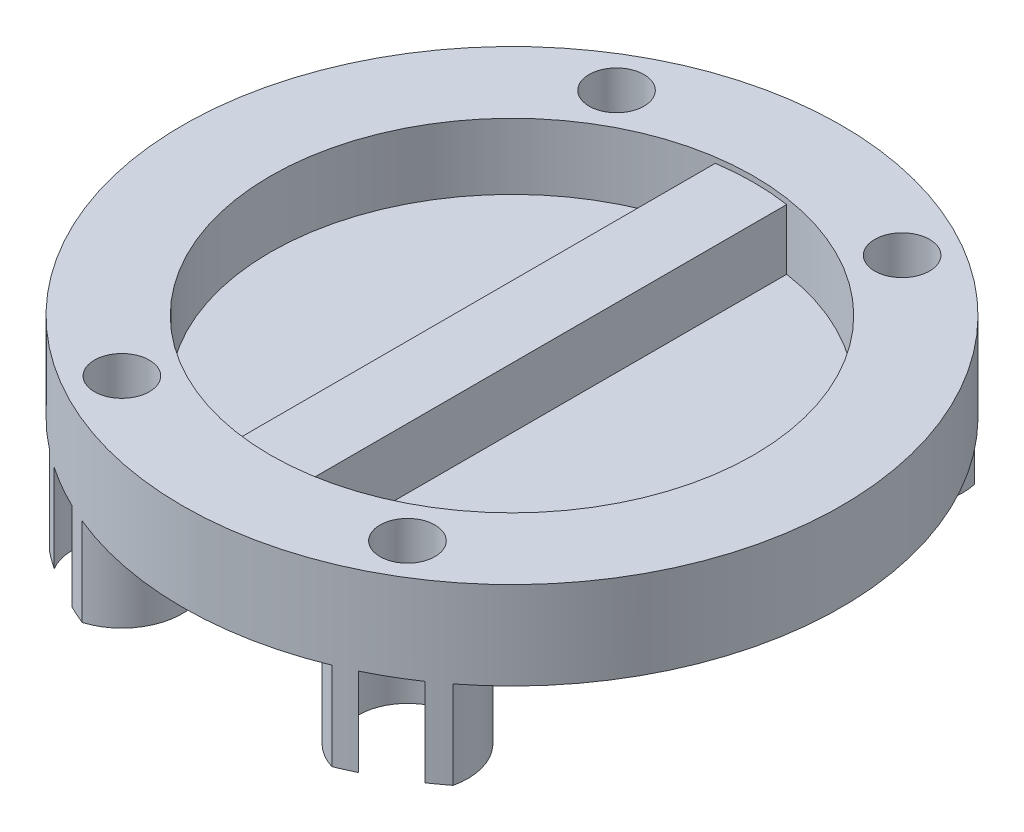
ISO-10303-21;
HEADER;
FILE_DESCRIPTION(('STEP AP214'),'2;1');
FILE_NAME('part.step','',(''),(''),'','','');
FILE_SCHEMA(('AUTOMOTIVE_DESIGN { 1 0 10303 214 1 1 1 1 }'));
ENDSEC;
DATA;
#1=APPLICATION_CONTEXT('core data for automotive mechanical design processes');
#2=APPLICATION_PROTOCOL_DEFINITION('international standard','automotive_design',2000,#1);
#3=PRODUCT_CONTEXT('',#1,'mechanical');
#4=PRODUCT('Part','Part','',(#3));
#5=PRODUCT_RELATED_PRODUCT_CATEGORY('part','',(#4));
#6=PRODUCT_DEFINITION_FORMATION('','',#4);
#7=PRODUCT_DEFINITION_CONTEXT('part definition',#1,'design');
#8=PRODUCT_DEFINITION('design','',#6,#7);
#9=PRODUCT_DEFINITION_SHAPE('','',#8);
#10=(LENGTH_UNIT() NAMED_UNIT(*) SI_UNIT(.MILLI.,.METRE.));
#11=(NAMED_UNIT(*) PLANE_ANGLE_UNIT() SI_UNIT($,.RADIAN.));
#12=(NAMED_UNIT(*) SI_UNIT($,.STERADIAN.) SOLID_ANGLE_UNIT());
#13=UNCERTAINTY_MEASURE_WITH_UNIT(LENGTH_MEASURE(1.E-05),#10,'distance_accuracy_value','');
#14=(GEOMETRIC_REPRESENTATION_CONTEXT(3) GLOBAL_UNCERTAINTY_ASSIGNED_CONTEXT((#13)) GLOBAL_UNIT_ASSIGNED_CONTEXT((#10,
#11,#12)) REPRESENTATION_CONTEXT('',''));
#15=CARTESIAN_POINT('',(0.,0.,0.));
#16=DIRECTION('',(0.,0.,1.));
#17=DIRECTION('',(1.,0.,0.));
#18=AXIS2_PLACEMENT_3D('',#15,#16,#17);
#19=CARTESIAN_POINT('',(0.,0.,0.));
#20=DIRECTION('',(0.,1.,0.));
#21=DIRECTION('',(0.,0.,1.));
#22=AXIS2_PLACEMENT_3D('',#19,#20,#21);
#23=PLANE('',#22);
#24=CARTESIAN_POINT('',(0.,0.,0.));
#25=DIRECTION('',(0.,1.,0.));
#26=DIRECTION('',(0.,0.,1.));
#27=AXIS2_PLACEMENT_3D('',#24,#25,#26);
#28=CIRCLE('',#27,24.);
#29=CARTESIAN_POINT('',(-14.6932868781607,0.,-18.9764938994555));
#30=VERTEX_POINT('',#29);
#31=CARTESIAN_POINT('',(-14.6932868781607,0.,18.9764938994555));
#32=VERTEX_POINT('',#31);
#33=EDGE_CURVE('E403',#30,#32,#28,.T.);
#34=ORIENTED_EDGE('',*,*,#33,.F.);
#35=CARTESIAN_POINT('',(-10.4000000000001,0.,-18.0133283987163));
#36=DIRECTION('',(0.,1.,0.));
#37=DIRECTION('',(0.,0.,1.));
#38=AXIS2_PLACEMENT_3D('',#35,#36,#37);
#39=CIRCLE('',#38,4.39999999999999);
#40=CARTESIAN_POINT('',(-9.08748235260878,0.,-22.2130066513073));
#41=VERTEX_POINT('',#40);
#42=EDGE_CURVE('E111',#30,#41,#39,.T.);
#43=ORIENTED_EDGE('',*,*,#42,.T.);
#44=CARTESIAN_POINT('',(9.08748235260879,0.,-22.2130066513073));
#45=VERTEX_POINT('',#44);
#46=EDGE_CURVE('E496',#45,#41,#28,.T.);
#47=ORIENTED_EDGE('',*,*,#46,.F.);
#48=CARTESIAN_POINT('',(10.4000000000001,0.,-18.0133283987163));
#49=DIRECTION('',(0.,1.,0.));
#50=DIRECTION('',(0.,0.,1.));
#51=AXIS2_PLACEMENT_3D('',#48,#49,#50);
#52=CIRCLE('',#51,4.4);
#53=CARTESIAN_POINT('',(14.6932868781607,0.,-18.9764938994555));
#54=VERTEX_POINT('',#53);
#55=EDGE_CURVE('E304',#54,#45,#52,.F.);
#56=ORIENTED_EDGE('',*,*,#55,.F.);
#57=CARTESIAN_POINT('',(14.6932868781605,0.,18.9764938994556));
#58=VERTEX_POINT('',#57);
#59=EDGE_CURVE('E490',#58,#54,#28,.T.);
#60=ORIENTED_EDGE('',*,*,#59,.F.);
#61=CARTESIAN_POINT('',(10.4000000000001,0.,18.0133283987163));
#62=DIRECTION('',(0.,1.,0.));
#63=DIRECTION('',(0.,0.,1.));
#64=AXIS2_PLACEMENT_3D('',#61,#62,#63);
#65=CIRCLE('',#64,4.4);
#66=CARTESIAN_POINT('',(9.08748235260868,0.,22.2130066513074));
#67=VERTEX_POINT('',#66);
#68=EDGE_CURVE('E328',#58,#67,#65,.T.);
#69=ORIENTED_EDGE('',*,*,#68,.T.);
#70=CARTESIAN_POINT('',(-9.08748235260879,0.,22.2130066513073));
#71=VERTEX_POINT('',#70);
#72=EDGE_CURVE('E409',#71,#67,#28,.T.);
#73=ORIENTED_EDGE('',*,*,#72,.F.);
#74=CARTESIAN_POINT('',(-10.4000000000001,0.,18.0133283987163));
#75=DIRECTION('',(0.,1.,0.));
#76=DIRECTION('',(0.,0.,1.));
#77=AXIS2_PLACEMENT_3D('',#74,#75,#76);
#78=CIRCLE('',#77,4.39999999999999);
#79=EDGE_CURVE('E344',#32,#71,#78,.F.);
#80=ORIENTED_EDGE('',*,*,#79,.F.);
#81=EDGE_LOOP('',(#34,#43,#47,#56,#60,#69,#73,#80));
#82=FACE_BOUND('',#81,.T.);
#83=DIRECTION('',(0.,0.,1.));
#84=VECTOR('',#83,1.);
#85=CARTESIAN_POINT('',(-1.,0.,-19.6));
#86=LINE('',#85,#84);
#87=CARTESIAN_POINT('',(-1.,0.,-19.6));
#88=VERTEX_POINT('',#87);
#89=CARTESIAN_POINT('',(-0.999999999999999,0.,19.6));
#90=VERTEX_POINT('',#89);
#91=EDGE_CURVE('E103',#88,#90,#86,.T.);
#92=ORIENTED_EDGE('',*,*,#91,.T.);
#93=DIRECTION('',(1.,0.,0.));
#94=VECTOR('',#93,1.);
#95=CARTESIAN_POINT('',(-0.999999999999999,0.,19.6));
#96=LINE('',#95,#94);
#97=CARTESIAN_POINT('',(1.00000000000001,0.,19.6));
#98=VERTEX_POINT('',#97);
#99=EDGE_CURVE('E269',#90,#98,#96,.T.);
#100=ORIENTED_EDGE('',*,*,#99,.T.);
#101=DIRECTION('',(0.,0.,1.));
#102=VECTOR('',#101,1.);
#103=CARTESIAN_POINT('',(0.999999999999998,0.,-19.6));
#104=LINE('',#103,#102);
#105=CARTESIAN_POINT('',(0.999999999999998,0.,-19.6));
#106=VERTEX_POINT('',#105);
#107=EDGE_CURVE('E753',#106,#98,#104,.T.);
#108=ORIENTED_EDGE('',*,*,#107,.F.);
#109=DIRECTION('',(1.,0.,0.));
#110=VECTOR('',#109,1.);
#111=CARTESIAN_POINT('',(-1.,0.,-19.6));
#112=LINE('',#111,#110);
#113=EDGE_CURVE('E265',#88,#106,#112,.T.);
#114=ORIENTED_EDGE('',*,*,#113,.F.);
#115=EDGE_LOOP('',(#92,#100,#108,#114));
#116=FACE_BOUND('',#115,.T.);
#117=ADVANCED_FACE('F89',(#82,#116),#23,.F.);
#118=CARTESIAN_POINT('',(-10.4000000000001,0.,-18.0133283987163));
#119=DIRECTION('',(0.,1.,0.));
#120=DIRECTION('',(0.,0.,1.));
#121=AXIS2_PLACEMENT_3D('',#118,#119,#120);
#122=CIRCLE('',#121,2.);
#123=CARTESIAN_POINT('',(-10.4000000000001,0.,-16.0133283987163));
#124=VERTEX_POINT('',#123);
#125=EDGE_CURVE('E392',#124,#124,#122,.T.);
#126=ORIENTED_EDGE('',*,*,#125,.T.);
#127=EDGE_LOOP('',(#126));
#128=FACE_BOUND('',#127,.T.);
#129=CARTESIAN_POINT('',(-10.4000000000001,0.,-18.0133283987163));
#130=DIRECTION('',(0.,1.,0.));
#131=DIRECTION('',(0.,0.,1.));
#132=AXIS2_PLACEMENT_3D('',#129,#130,#131);
#133=CIRCLE('',#132,3.6);
#134=CARTESIAN_POINT('',(-13.5004873272167,0.,-19.842803277956));
#135=VERTEX_POINT('',#134);
#136=CARTESIAN_POINT('',(-10.4341280573989,0.,-21.6131666278175));
#137=VERTEX_POINT('',#136);
#138=EDGE_CURVE('E270',#135,#137,#133,.T.);
#139=ORIENTED_EDGE('',*,*,#138,.F.);
#140=EDGE_CURVE('E499',#137,#135,#28,.T.);
#141=ORIENTED_EDGE('',*,*,#140,.F.);
#142=EDGE_LOOP('',(#139,#141));
#143=FACE_BOUND('',#142,.T.);
#144=ADVANCED_FACE('F464',(#128,#143),#23,.F.);
#145=CARTESIAN_POINT('',(10.4000000000001,0.,-18.0133283987163));
#146=DIRECTION('',(0.,-1.,0.));
#147=DIRECTION('',(0.,0.,-1.));
#148=AXIS2_PLACEMENT_3D('',#145,#146,#147);
#149=CIRCLE('',#148,2.);
#150=CARTESIAN_POINT('',(10.4000000000001,0.,-20.0133283987163));
#151=VERTEX_POINT('',#150);
#152=EDGE_CURVE('E386',#151,#151,#149,.T.);
#153=ORIENTED_EDGE('',*,*,#152,.F.);
#154=EDGE_LOOP('',(#153));
#155=FACE_BOUND('',#154,.T.);
#156=CARTESIAN_POINT('',(13.5004873272167,0.,-19.842803277956));
#157=VERTEX_POINT('',#156);
#158=CARTESIAN_POINT('',(10.4341280573989,0.,-21.6131666278175));
#159=VERTEX_POINT('',#158);
#160=EDGE_CURVE('E493',#157,#159,#28,.T.);
#161=ORIENTED_EDGE('',*,*,#160,.F.);
#162=CARTESIAN_POINT('',(10.4000000000001,0.,-18.0133283987163));
#163=DIRECTION('',(0.,1.,0.));
#164=DIRECTION('',(0.,0.,1.));
#165=AXIS2_PLACEMENT_3D('',#162,#163,#164);
#166=CIRCLE('',#165,3.6);
#167=EDGE_CURVE('E294',#157,#159,#166,.F.);
#168=ORIENTED_EDGE('',*,*,#167,.T.);
#169=EDGE_LOOP('',(#161,#168));
#170=FACE_BOUND('',#169,.T.);
#171=ADVANCED_FACE('F470',(#155,#170),#23,.F.);
#172=CARTESIAN_POINT('',(10.4000000000001,0.,18.0133283987163));
#173=DIRECTION('',(0.,1.,0.));
#174=DIRECTION('',(0.,0.,1.));
#175=AXIS2_PLACEMENT_3D('',#172,#173,#174);
#176=CIRCLE('',#175,2.);
#177=CARTESIAN_POINT('',(10.4000000000001,0.,20.0133283987163));
#178=VERTEX_POINT('',#177);
#179=EDGE_CURVE('E370',#178,#178,#176,.T.);
#180=ORIENTED_EDGE('',*,*,#179,.T.);
#181=EDGE_LOOP('',(#180));
#182=FACE_BOUND('',#181,.T.);
#183=CARTESIAN_POINT('',(10.4000000000001,0.,18.0133283987163));
#184=DIRECTION('',(0.,1.,0.));
#185=DIRECTION('',(0.,0.,1.));
#186=AXIS2_PLACEMENT_3D('',#183,#184,#185);
#187=CIRCLE('',#186,3.60000000000002);
#188=CARTESIAN_POINT('',(13.5004873272166,0.,19.8428032779561));
#189=VERTEX_POINT('',#188);
#190=CARTESIAN_POINT('',(10.4341280573988,0.,21.6131666278175));
#191=VERTEX_POINT('',#190);
#192=EDGE_CURVE('E319',#189,#191,#187,.T.);
#193=ORIENTED_EDGE('',*,*,#192,.F.);
#194=EDGE_CURVE('E412',#191,#189,#28,.T.);
#195=ORIENTED_EDGE('',*,*,#194,.F.);
#196=EDGE_LOOP('',(#193,#195));
#197=FACE_BOUND('',#196,.T.);
#198=ADVANCED_FACE('F475',(#182,#197),#23,.F.);
#199=CARTESIAN_POINT('',(-10.4000000000001,0.,18.0133283987163));
#200=DIRECTION('',(0.,-1.,0.));
#201=DIRECTION('',(0.,0.,-1.));
#202=AXIS2_PLACEMENT_3D('',#199,#200,#201);
#203=CIRCLE('',#202,2.);
#204=CARTESIAN_POINT('',(-10.4000000000001,0.,16.0133283987163));
#205=VERTEX_POINT('',#204);
#206=EDGE_CURVE('E380',#205,#205,#203,.T.);
#207=ORIENTED_EDGE('',*,*,#206,.F.);
#208=EDGE_LOOP('',(#207));
#209=FACE_BOUND('',#208,.T.);
#210=CARTESIAN_POINT('',(-13.5004873272166,0.,19.8428032779561));
#211=VERTEX_POINT('',#210);
#212=CARTESIAN_POINT('',(-10.4341280573989,0.,21.6131666278175));
#213=VERTEX_POINT('',#212);
#214=EDGE_CURVE('E408',#211,#213,#28,.T.);
#215=ORIENTED_EDGE('',*,*,#214,.F.);
#216=CARTESIAN_POINT('',(-10.4000000000001,0.,18.0133283987163));
#217=DIRECTION('',(0.,1.,0.));
#218=DIRECTION('',(0.,0.,1.));
#219=AXIS2_PLACEMENT_3D('',#216,#217,#218);
#220=CIRCLE('',#219,3.6);
#221=EDGE_CURVE('E354',#211,#213,#220,.F.);
#222=ORIENTED_EDGE('',*,*,#221,.T.);
#223=EDGE_LOOP('',(#215,#222));
#224=FACE_BOUND('',#223,.T.);
#225=ADVANCED_FACE('F466',(#209,#224),#23,.F.);
#226=CARTESIAN_POINT('',(0.,6.,0.));
#227=DIRECTION('',(0.,1.,0.));
#228=DIRECTION('',(0.,0.,1.));
#229=AXIS2_PLACEMENT_3D('',#226,#227,#228);
#230=PLANE('',#229);
#231=CARTESIAN_POINT('',(0.,6.,0.));
#232=DIRECTION('',(0.,1.,0.));
#233=DIRECTION('',(0.,0.,1.));
#234=AXIS2_PLACEMENT_3D('',#231,#232,#233);
#235=CIRCLE('',#234,17.6);
#236=CARTESIAN_POINT('',(-2.60000000000001,6.,-17.4068951855292));
#237=VERTEX_POINT('',#236);
#238=CARTESIAN_POINT('',(2.60000000000001,6.,-17.4068951855292));
#239=VERTEX_POINT('',#238);
#240=EDGE_CURVE('E12',#237,#239,#235,.F.);
#241=ORIENTED_EDGE('',*,*,#240,.F.);
#242=DIRECTION('',(0.,0.,1.));
#243=VECTOR('',#242,1.);
#244=CARTESIAN_POINT('',(-2.60000000000001,6.,-21.2));
#245=LINE('',#244,#243);
#246=CARTESIAN_POINT('',(-2.60000000000001,6.,17.4068951855292));
#247=VERTEX_POINT('',#246);
#248=EDGE_CURVE('E423',#237,#247,#245,.T.);
#249=ORIENTED_EDGE('',*,*,#248,.T.);
#250=CARTESIAN_POINT('',(2.60000000000002,6.,17.4068951855292));
#251=VERTEX_POINT('',#250);
#252=EDGE_CURVE('E92',#251,#247,#235,.F.);
#253=ORIENTED_EDGE('',*,*,#252,.F.);
#254=DIRECTION('',(0.,0.,1.));
#255=VECTOR('',#254,1.);
#256=CARTESIAN_POINT('',(2.60000000000001,6.,-21.2));
#257=LINE('',#256,#255);
#258=EDGE_CURVE('E425',#239,#251,#257,.T.);
#259=ORIENTED_EDGE('',*,*,#258,.F.);
#260=EDGE_LOOP('',(#241,#249,#253,#259));
#261=FACE_BOUND('',#260,.T.);
#262=ADVANCED_FACE('F453',(#261),#230,.T.);
#263=CARTESIAN_POINT('',(0.,1.6,0.));
#264=DIRECTION('',(0.,1.,0.));
#265=DIRECTION('',(0.,0.,1.));
#266=AXIS2_PLACEMENT_3D('',#263,#264,#265);
#267=PLANE('',#266);
#268=CARTESIAN_POINT('',(0.,1.6,0.));
#269=DIRECTION('',(0.,1.,0.));
#270=DIRECTION('',(0.,0.,1.));
#271=AXIS2_PLACEMENT_3D('',#268,#269,#270);
#272=CIRCLE('',#271,17.6);
#273=CARTESIAN_POINT('',(-2.60000000000001,1.6,-17.4068951855292));
#274=VERTEX_POINT('',#273);
#275=CARTESIAN_POINT('',(-2.60000000000001,1.6,17.4068951855292));
#276=VERTEX_POINT('',#275);
#277=EDGE_CURVE('E433',#274,#276,#272,.T.);
#278=ORIENTED_EDGE('',*,*,#277,.T.);
#279=DIRECTION('',(0.,0.,-1.));
#280=VECTOR('',#279,1.);
#281=CARTESIAN_POINT('',(-2.60000000000001,1.6,0.));
#282=LINE('',#281,#280);
#283=EDGE_CURVE('E431',#276,#274,#282,.T.);
#284=ORIENTED_EDGE('',*,*,#283,.T.);
#285=EDGE_LOOP('',(#278,#284));
#286=FACE_BOUND('',#285,.T.);
#287=ADVANCED_FACE('F442',(#286),#267,.T.);
#288=DIRECTION('',(0.,0.,-1.));
#289=VECTOR('',#288,1.);
#290=CARTESIAN_POINT('',(2.60000000000002,1.6,0.));
#291=LINE('',#290,#289);
#292=CARTESIAN_POINT('',(2.60000000000002,1.6,17.4068951855292));
#293=VERTEX_POINT('',#292);
#294=CARTESIAN_POINT('',(2.60000000000001,1.6,-17.4068951855292));
#295=VERTEX_POINT('',#294);
#296=EDGE_CURVE('E428',#293,#295,#291,.T.);
#297=ORIENTED_EDGE('',*,*,#296,.F.);
#298=EDGE_CURVE('E434',#293,#295,#272,.T.);
#299=ORIENTED_EDGE('',*,*,#298,.T.);
#300=EDGE_LOOP('',(#297,#299));
#301=FACE_BOUND('',#300,.T.);
#302=ADVANCED_FACE('F456',(#301),#267,.T.);
#303=CARTESIAN_POINT('',(-2.60000000000001,6.,-21.2));
#304=DIRECTION('',(1.,0.,0.));
#305=DIRECTION('',(0.,0.,-1.));
#306=AXIS2_PLACEMENT_3D('',#303,#304,#305);
#307=PLANE('',#306);
#308=ORIENTED_EDGE('',*,*,#283,.F.);
#309=DIRECTION('',(0.,-1.,0.));
#310=VECTOR('',#309,1.);
#311=CARTESIAN_POINT('',(-2.60000000000001,6.4,17.4068951855292));
#312=LINE('',#311,#310);
#313=EDGE_CURVE('E415',#276,#247,#312,.F.);
#314=ORIENTED_EDGE('',*,*,#313,.T.);
#315=ORIENTED_EDGE('',*,*,#248,.F.);
#316=DIRECTION('',(0.,-1.,0.));
#317=VECTOR('',#316,1.);
#318=CARTESIAN_POINT('',(-2.60000000000001,6.4,-17.4068951855292));
#319=LINE('',#318,#317);
#320=EDGE_CURVE('E421',#237,#274,#319,.T.);
#321=ORIENTED_EDGE('',*,*,#320,.T.);
#322=EDGE_LOOP('',(#308,#314,#315,#321));
#323=FACE_BOUND('',#322,.T.);
#324=ADVANCED_FACE('F447',(#323),#307,.F.);
#325=CARTESIAN_POINT('',(2.60000000000001,6.,-21.2));
#326=DIRECTION('',(1.,0.,0.));
#327=DIRECTION('',(0.,0.,-1.));
#328=AXIS2_PLACEMENT_3D('',#325,#326,#327);
#329=PLANE('',#328);
#330=DIRECTION('',(0.,-1.,0.));
#331=VECTOR('',#330,1.);
#332=CARTESIAN_POINT('',(2.60000000000002,6.4,17.4068951855292));
#333=LINE('',#332,#331);
#334=EDGE_CURVE('E407',#293,#251,#333,.F.);
#335=ORIENTED_EDGE('',*,*,#334,.F.);
#336=ORIENTED_EDGE('',*,*,#296,.T.);
#337=DIRECTION('',(0.,-1.,0.));
#338=VECTOR('',#337,1.);
#339=CARTESIAN_POINT('',(2.60000000000001,6.4,-17.4068951855292));
#340=LINE('',#339,#338);
#341=EDGE_CURVE('E418',#239,#295,#340,.T.);
#342=ORIENTED_EDGE('',*,*,#341,.F.);
#343=ORIENTED_EDGE('',*,*,#258,.T.);
#344=EDGE_LOOP('',(#335,#336,#342,#343));
#345=FACE_BOUND('',#344,.T.);
#346=ADVANCED_FACE('F455',(#345),#329,.T.);
#347=CARTESIAN_POINT('',(0.,6.4,0.));
#348=DIRECTION('',(0.,-1.,0.));
#349=DIRECTION('',(0.,0.,-1.));
#350=AXIS2_PLACEMENT_3D('',#347,#348,#349);
#351=CYLINDRICAL_SURFACE('',#350,17.6);
#352=ORIENTED_EDGE('',*,*,#313,.F.);
#353=ORIENTED_EDGE('',*,*,#277,.F.);
#354=ORIENTED_EDGE('',*,*,#320,.F.);
#355=ORIENTED_EDGE('',*,*,#240,.T.);
#356=ORIENTED_EDGE('',*,*,#341,.T.);
#357=ORIENTED_EDGE('',*,*,#298,.F.);
#358=ORIENTED_EDGE('',*,*,#334,.T.);
#359=ORIENTED_EDGE('',*,*,#252,.T.);
#360=EDGE_LOOP('',(#352,#353,#354,#355,#356,#357,#358,#359));
#361=FACE_BOUND('',#360,.T.);
#362=CARTESIAN_POINT('',(0.,6.4,0.));
#363=DIRECTION('',(0.,1.,0.));
#364=DIRECTION('',(0.,0.,1.));
#365=AXIS2_PLACEMENT_3D('',#362,#363,#364);
#366=CIRCLE('',#365,17.6);
#367=CARTESIAN_POINT('',(0.,6.4,17.6));
#368=VERTEX_POINT('',#367);
#369=EDGE_CURVE('E398',#368,#368,#366,.T.);
#370=ORIENTED_EDGE('',*,*,#369,.T.);
#371=EDGE_LOOP('',(#370));
#372=FACE_BOUND('',#371,.T.);
#373=ADVANCED_FACE('F449',(#361,#372),#351,.F.);
#374=CARTESIAN_POINT('',(0.,6.4,0.));
#375=DIRECTION('',(0.,1.,0.));
#376=DIRECTION('',(0.,0.,1.));
#377=AXIS2_PLACEMENT_3D('',#374,#375,#376);
#378=PLANE('',#377);
#379=CARTESIAN_POINT('',(-10.4000000000001,6.4,-18.0133283987163));
#380=DIRECTION('',(0.,1.,0.));
#381=DIRECTION('',(0.,0.,1.));
#382=AXIS2_PLACEMENT_3D('',#379,#380,#381);
#383=CIRCLE('',#382,2.);
#384=CARTESIAN_POINT('',(-10.4000000000001,6.4,-16.0133283987163));
#385=VERTEX_POINT('',#384);
#386=EDGE_CURVE('E395',#385,#385,#383,.T.);
#387=ORIENTED_EDGE('',*,*,#386,.F.);
#388=EDGE_LOOP('',(#387));
#389=FACE_BOUND('',#388,.T.);
#390=CARTESIAN_POINT('',(0.,6.4,0.));
#391=DIRECTION('',(0.,1.,0.));
#392=DIRECTION('',(0.,0.,1.));
#393=AXIS2_PLACEMENT_3D('',#390,#391,#392);
#394=CIRCLE('',#393,24.);
#395=CARTESIAN_POINT('',(0.,6.4,24.));
#396=VERTEX_POINT('',#395);
#397=EDGE_CURVE('E404',#396,#396,#394,.T.);
#398=ORIENTED_EDGE('',*,*,#397,.T.);
#399=EDGE_LOOP('',(#398));
#400=FACE_BOUND('',#399,.T.);
#401=ORIENTED_EDGE('',*,*,#369,.F.);
#402=EDGE_LOOP('',(#401));
#403=FACE_BOUND('',#402,.T.);
#404=CARTESIAN_POINT('',(10.4000000000001,6.4,-18.0133283987163));
#405=DIRECTION('',(0.,-1.,0.));
#406=DIRECTION('',(0.,0.,-1.));
#407=AXIS2_PLACEMENT_3D('',#404,#405,#406);
#408=CIRCLE('',#407,2.);
#409=CARTESIAN_POINT('',(10.4000000000001,6.4,-20.0133283987163));
#410=VERTEX_POINT('',#409);
#411=EDGE_CURVE('E389',#410,#410,#408,.T.);
#412=ORIENTED_EDGE('',*,*,#411,.T.);
#413=EDGE_LOOP('',(#412));
#414=FACE_BOUND('',#413,.T.);
#415=CARTESIAN_POINT('',(-10.4000000000001,6.4,18.0133283987163));
#416=DIRECTION('',(0.,-1.,0.));
#417=DIRECTION('',(0.,0.,-1.));
#418=AXIS2_PLACEMENT_3D('',#415,#416,#417);
#419=CIRCLE('',#418,2.);
#420=CARTESIAN_POINT('',(-10.4000000000001,6.4,16.0133283987163));
#421=VERTEX_POINT('',#420);
#422=EDGE_CURVE('E383',#421,#421,#419,.T.);
#423=ORIENTED_EDGE('',*,*,#422,.T.);
#424=EDGE_LOOP('',(#423));
#425=FACE_BOUND('',#424,.T.);
#426=CARTESIAN_POINT('',(10.4000000000001,6.4,18.0133283987163));
#427=DIRECTION('',(0.,1.,0.));
#428=DIRECTION('',(0.,0.,1.));
#429=AXIS2_PLACEMENT_3D('',#426,#427,#428);
#430=CIRCLE('',#429,2.);
#431=CARTESIAN_POINT('',(10.4000000000001,6.4,20.0133283987163));
#432=VERTEX_POINT('',#431);
#433=EDGE_CURVE('E377',#432,#432,#430,.T.);
#434=ORIENTED_EDGE('',*,*,#433,.F.);
#435=EDGE_LOOP('',(#434));
#436=FACE_BOUND('',#435,.T.);
#437=ADVANCED_FACE('F546',(#389,#400,#403,#414,#425,#436),#378,.T.);
#438=CARTESIAN_POINT('',(0.,6.4,0.));
#439=DIRECTION('',(0.,-1.,0.));
#440=DIRECTION('',(0.,0.,-1.));
#441=AXIS2_PLACEMENT_3D('',#438,#439,#440);
#442=CYLINDRICAL_SURFACE('',#441,24.);
#443=ORIENTED_EDGE('',*,*,#397,.F.);
#444=EDGE_LOOP('',(#443));
#445=FACE_BOUND('',#444,.T.);
#446=ORIENTED_EDGE('',*,*,#72,.T.);
#447=DIRECTION('',(0.,1.,0.));
#448=VECTOR('',#447,1.);
#449=CARTESIAN_POINT('',(9.08748235260868,-6.4,22.2130066513074));
#450=LINE('',#449,#448);
#451=CARTESIAN_POINT('',(9.08748235260868,-6.4,22.2130066513074));
#452=VERTEX_POINT('',#451);
#453=EDGE_CURVE('E345',#452,#67,#450,.T.);
#454=ORIENTED_EDGE('',*,*,#453,.F.);
#455=CARTESIAN_POINT('',(0.,-6.4,0.));
#456=DIRECTION('',(0.,1.,0.));
#457=DIRECTION('',(0.,0.,1.));
#458=AXIS2_PLACEMENT_3D('',#455,#456,#457);
#459=CIRCLE('',#458,24.);
#460=CARTESIAN_POINT('',(10.4341280573988,-6.4,21.6131666278175));
#461=VERTEX_POINT('',#460);
#462=EDGE_CURVE('E334',#452,#461,#459,.T.);
#463=ORIENTED_EDGE('',*,*,#462,.T.);
#464=DIRECTION('',(0.,1.,0.));
#465=VECTOR('',#464,1.);
#466=CARTESIAN_POINT('',(10.4341280573988,-6.4,21.6131666278175));
#467=LINE('',#466,#465);
#468=EDGE_CURVE('E342',#461,#191,#467,.T.);
#469=ORIENTED_EDGE('',*,*,#468,.T.);
#470=ORIENTED_EDGE('',*,*,#194,.T.);
#471=DIRECTION('',(0.,1.,0.));
#472=VECTOR('',#471,1.);
#473=CARTESIAN_POINT('',(13.5004873272166,-6.4,19.8428032779561));
#474=LINE('',#473,#472);
#475=CARTESIAN_POINT('',(13.5004873272166,-6.4,19.8428032779561));
#476=VERTEX_POINT('',#475);
#477=EDGE_CURVE('E337',#476,#189,#474,.T.);
#478=ORIENTED_EDGE('',*,*,#477,.F.);
#479=CARTESIAN_POINT('',(0.,-6.4,0.));
#480=DIRECTION('',(0.,1.,0.));
#481=DIRECTION('',(0.,0.,1.));
#482=AXIS2_PLACEMENT_3D('',#479,#480,#481);
#483=CIRCLE('',#482,24.);
#484=CARTESIAN_POINT('',(14.6932868781605,-6.4,18.9764938994556));
#485=VERTEX_POINT('',#484);
#486=EDGE_CURVE('E327',#476,#485,#483,.T.);
#487=ORIENTED_EDGE('',*,*,#486,.T.);
#488=DIRECTION('',(0.,1.,0.));
#489=VECTOR('',#488,1.);
#490=CARTESIAN_POINT('',(14.6932868781605,-6.4,18.9764938994556));
#491=LINE('',#490,#489);
#492=EDGE_CURVE('E347',#485,#58,#491,.T.);
#493=ORIENTED_EDGE('',*,*,#492,.T.);
#494=ORIENTED_EDGE('',*,*,#59,.T.);
#495=DIRECTION('',(0.,1.,0.));
#496=VECTOR('',#495,1.);
#497=CARTESIAN_POINT('',(14.6932868781607,-6.4,-18.9764938994555));
#498=LINE('',#497,#496);
#499=CARTESIAN_POINT('',(14.6932868781607,-6.4,-18.9764938994555));
#500=VERTEX_POINT('',#499);
#501=EDGE_CURVE('E317',#500,#54,#498,.T.);
#502=ORIENTED_EDGE('',*,*,#501,.F.);
#503=CARTESIAN_POINT('',(0.,-6.4,0.));
#504=DIRECTION('',(0.,1.,0.));
#505=DIRECTION('',(0.,0.,1.));
#506=AXIS2_PLACEMENT_3D('',#503,#504,#505);
#507=CIRCLE('',#506,24.);
#508=CARTESIAN_POINT('',(13.5004873272167,-6.4,-19.842803277956));
#509=VERTEX_POINT('',#508);
#510=EDGE_CURVE('E300',#500,#509,#507,.T.);
#511=ORIENTED_EDGE('',*,*,#510,.T.);
#512=DIRECTION('',(0.,1.,0.));
#513=VECTOR('',#512,1.);
#514=CARTESIAN_POINT('',(13.5004873272167,-6.4,-19.842803277956));
#515=LINE('',#514,#513);
#516=EDGE_CURVE('E312',#509,#157,#515,.T.);
#517=ORIENTED_EDGE('',*,*,#516,.T.);
#518=ORIENTED_EDGE('',*,*,#160,.T.);
#519=DIRECTION('',(0.,1.,0.));
#520=VECTOR('',#519,1.);
#521=CARTESIAN_POINT('',(10.4341280573989,-6.4,-21.6131666278174));
#522=LINE('',#521,#520);
#523=CARTESIAN_POINT('',(10.4341280573989,-6.4,-21.6131666278174));
#524=VERTEX_POINT('',#523);
#525=EDGE_CURVE('E322',#524,#159,#522,.T.);
#526=ORIENTED_EDGE('',*,*,#525,.F.);
#527=CARTESIAN_POINT('',(0.,-6.4,0.));
#528=DIRECTION('',(0.,1.,0.));
#529=DIRECTION('',(0.,0.,1.));
#530=AXIS2_PLACEMENT_3D('',#527,#528,#529);
#531=CIRCLE('',#530,24.);
#532=CARTESIAN_POINT('',(9.08748235260879,-6.4,-22.2130066513073));
#533=VERTEX_POINT('',#532);
#534=EDGE_CURVE('E307',#524,#533,#531,.T.);
#535=ORIENTED_EDGE('',*,*,#534,.T.);
#536=DIRECTION('',(0.,1.,0.));
#537=VECTOR('',#536,1.);
#538=CARTESIAN_POINT('',(9.08748235260879,-6.4,-22.2130066513073));
#539=LINE('',#538,#537);
#540=EDGE_CURVE('E320',#533,#45,#539,.T.);
#541=ORIENTED_EDGE('',*,*,#540,.T.);
#542=ORIENTED_EDGE('',*,*,#46,.T.);
#543=DIRECTION('',(0.,1.,0.));
#544=VECTOR('',#543,1.);
#545=CARTESIAN_POINT('',(-9.08748235260878,-6.4,-22.2130066513073));
#546=LINE('',#545,#544);
#547=CARTESIAN_POINT('',(-9.08748235260878,-6.4,-22.2130066513073));
#548=VERTEX_POINT('',#547);
#549=EDGE_CURVE('E295',#548,#41,#546,.T.);
#550=ORIENTED_EDGE('',*,*,#549,.F.);
#551=CARTESIAN_POINT('',(0.,-6.4,0.));
#552=DIRECTION('',(0.,1.,0.));
#553=DIRECTION('',(0.,0.,1.));
#554=AXIS2_PLACEMENT_3D('',#551,#552,#553);
#555=CIRCLE('',#554,24.);
#556=CARTESIAN_POINT('',(-10.4341280573989,-6.4,-21.6131666278175));
#557=VERTEX_POINT('',#556);
#558=EDGE_CURVE('E287',#548,#557,#555,.T.);
#559=ORIENTED_EDGE('',*,*,#558,.T.);
#560=DIRECTION('',(0.,1.,0.));
#561=VECTOR('',#560,1.);
#562=CARTESIAN_POINT('',(-10.4341280573989,-6.4,-21.6131666278175));
#563=LINE('',#562,#561);
#564=EDGE_CURVE('E292',#557,#137,#563,.T.);
#565=ORIENTED_EDGE('',*,*,#564,.T.);
#566=ORIENTED_EDGE('',*,*,#140,.T.);
#567=DIRECTION('',(0.,1.,0.));
#568=VECTOR('',#567,1.);
#569=CARTESIAN_POINT('',(-13.5004873272167,-6.4,-19.842803277956));
#570=LINE('',#569,#568);
#571=CARTESIAN_POINT('',(-13.5004873272167,-6.4,-19.842803277956));
#572=VERTEX_POINT('',#571);
#573=EDGE_CURVE('E289',#572,#135,#570,.T.);
#574=ORIENTED_EDGE('',*,*,#573,.F.);
#575=CARTESIAN_POINT('',(0.,-6.4,0.));
#576=DIRECTION('',(0.,1.,0.));
#577=DIRECTION('',(0.,0.,1.));
#578=AXIS2_PLACEMENT_3D('',#575,#576,#577);
#579=CIRCLE('',#578,24.);
#580=CARTESIAN_POINT('',(-14.6932868781607,-6.4,-18.9764938994555));
#581=VERTEX_POINT('',#580);
#582=EDGE_CURVE('E281',#572,#581,#579,.T.);
#583=ORIENTED_EDGE('',*,*,#582,.T.);
#584=DIRECTION('',(0.,1.,0.));
#585=VECTOR('',#584,1.);
#586=CARTESIAN_POINT('',(-14.6932868781607,-6.4,-18.9764938994555));
#587=LINE('',#586,#585);
#588=EDGE_CURVE('E297',#581,#30,#587,.T.);
#589=ORIENTED_EDGE('',*,*,#588,.T.);
#590=ORIENTED_EDGE('',*,*,#33,.T.);
#591=DIRECTION('',(0.,1.,0.));
#592=VECTOR('',#591,1.);
#593=CARTESIAN_POINT('',(-14.6932868781607,-6.4,18.9764938994555));
#594=LINE('',#593,#592);
#595=CARTESIAN_POINT('',(-14.6932868781607,-6.4,18.9764938994555));
#596=VERTEX_POINT('',#595);
#597=EDGE_CURVE('E363',#596,#32,#594,.T.);
#598=ORIENTED_EDGE('',*,*,#597,.F.);
#599=CARTESIAN_POINT('',(0.,-6.4,0.));
#600=DIRECTION('',(0.,1.,0.));
#601=DIRECTION('',(0.,0.,1.));
#602=AXIS2_PLACEMENT_3D('',#599,#600,#601);
#603=CIRCLE('',#602,24.);
#604=CARTESIAN_POINT('',(-13.5004873272166,-6.4,19.8428032779561));
#605=VERTEX_POINT('',#604);
#606=EDGE_CURVE('E353',#596,#605,#603,.T.);
#607=ORIENTED_EDGE('',*,*,#606,.T.);
#608=DIRECTION('',(0.,1.,0.));
#609=VECTOR('',#608,1.);
#610=CARTESIAN_POINT('',(-13.5004873272166,-6.4,19.8428032779561));
#611=LINE('',#610,#609);
#612=EDGE_CURVE('E373',#605,#211,#611,.T.);
#613=ORIENTED_EDGE('',*,*,#612,.T.);
#614=ORIENTED_EDGE('',*,*,#214,.T.);
#615=DIRECTION('',(0.,1.,0.));
#616=VECTOR('',#615,1.);
#617=CARTESIAN_POINT('',(-10.4341280573988,-6.4,21.6131666278175));
#618=LINE('',#617,#616);
#619=CARTESIAN_POINT('',(-10.4341280573988,-6.4,21.6131666278175));
#620=VERTEX_POINT('',#619);
#621=EDGE_CURVE('E371',#620,#213,#618,.T.);
#622=ORIENTED_EDGE('',*,*,#621,.F.);
#623=CARTESIAN_POINT('',(0.,-6.4,0.));
#624=DIRECTION('',(0.,1.,0.));
#625=DIRECTION('',(0.,0.,1.));
#626=AXIS2_PLACEMENT_3D('',#623,#624,#625);
#627=CIRCLE('',#626,24.);
#628=CARTESIAN_POINT('',(-9.08748235260879,-6.4,22.2130066513073));
#629=VERTEX_POINT('',#628);
#630=EDGE_CURVE('E360',#620,#629,#627,.T.);
#631=ORIENTED_EDGE('',*,*,#630,.T.);
#632=DIRECTION('',(0.,1.,0.));
#633=VECTOR('',#632,1.);
#634=CARTESIAN_POINT('',(-9.08748235260879,-6.4,22.2130066513073));
#635=LINE('',#634,#633);
#636=EDGE_CURVE('E368',#629,#71,#635,.T.);
#637=ORIENTED_EDGE('',*,*,#636,.T.);
#638=EDGE_LOOP('',(#446,#454,#463,#469,#470,#478,#487,#493,#494,#502,#511,#517,#518,#526,#535,
#541,#542,#550,#559,#565,#566,#574,#583,#589,#590,#598,#607,#613,#614,#622,#631,#637));
#639=FACE_BOUND('',#638,.T.);
#640=ADVANCED_FACE('F503',(#445,#639),#442,.T.);
#641=CARTESIAN_POINT('',(-10.4000000000001,6.4,-18.0133283987163));
#642=DIRECTION('',(0.,-1.,0.));
#643=DIRECTION('',(0.,0.,-1.));
#644=AXIS2_PLACEMENT_3D('',#641,#642,#643);
#645=CYLINDRICAL_SURFACE('',#644,2.);
#646=ORIENTED_EDGE('',*,*,#386,.T.);
#647=EDGE_LOOP('',(#646));
#648=FACE_BOUND('',#647,.T.);
#649=ORIENTED_EDGE('',*,*,#125,.F.);
#650=EDGE_LOOP('',(#649));
#651=FACE_BOUND('',#650,.T.);
#652=ADVANCED_FACE('F539',(#648,#651),#645,.F.);
#653=CARTESIAN_POINT('',(10.4000000000001,6.4,-18.0133283987163));
#654=DIRECTION('',(0.,-1.,0.));
#655=DIRECTION('',(0.,0.,-1.));
#656=AXIS2_PLACEMENT_3D('',#653,#654,#655);
#657=CYLINDRICAL_SURFACE('',#656,2.);
#658=ORIENTED_EDGE('',*,*,#411,.F.);
#659=EDGE_LOOP('',(#658));
#660=FACE_BOUND('',#659,.T.);
#661=ORIENTED_EDGE('',*,*,#152,.T.);
#662=EDGE_LOOP('',(#661));
#663=FACE_BOUND('',#662,.T.);
#664=ADVANCED_FACE('F535',(#660,#663),#657,.F.);
#665=CARTESIAN_POINT('',(-10.4000000000001,6.4,18.0133283987163));
#666=DIRECTION('',(0.,-1.,0.));
#667=DIRECTION('',(0.,0.,-1.));
#668=AXIS2_PLACEMENT_3D('',#665,#666,#667);
#669=CYLINDRICAL_SURFACE('',#668,2.);
#670=ORIENTED_EDGE('',*,*,#422,.F.);
#671=EDGE_LOOP('',(#670));
#672=FACE_BOUND('',#671,.T.);
#673=ORIENTED_EDGE('',*,*,#206,.T.);
#674=EDGE_LOOP('',(#673));
#675=FACE_BOUND('',#674,.T.);
#676=ADVANCED_FACE('F531',(#672,#675),#669,.F.);
#677=CARTESIAN_POINT('',(10.4000000000001,6.4,18.0133283987163));
#678=DIRECTION('',(0.,-1.,0.));
#679=DIRECTION('',(0.,0.,-1.));
#680=AXIS2_PLACEMENT_3D('',#677,#678,#679);
#681=CYLINDRICAL_SURFACE('',#680,2.);
#682=ORIENTED_EDGE('',*,*,#433,.T.);
#683=EDGE_LOOP('',(#682));
#684=FACE_BOUND('',#683,.T.);
#685=ORIENTED_EDGE('',*,*,#179,.F.);
#686=EDGE_LOOP('',(#685));
#687=FACE_BOUND('',#686,.T.);
#688=ADVANCED_FACE('F525',(#684,#687),#681,.F.);
#689=CARTESIAN_POINT('',(-10.4000000000001,-6.4,18.0133283987163));
#690=DIRECTION('',(0.,1.,0.));
#691=DIRECTION('',(0.,0.,1.));
#692=AXIS2_PLACEMENT_3D('',#689,#690,#691);
#693=CYLINDRICAL_SURFACE('',#692,4.39999999999999);
#694=ORIENTED_EDGE('',*,*,#79,.T.);
#695=ORIENTED_EDGE('',*,*,#636,.F.);
#696=CARTESIAN_POINT('',(-10.4000000000001,-6.4,18.0133283987163));
#697=DIRECTION('',(0.,1.,0.));
#698=DIRECTION('',(0.,0.,1.));
#699=AXIS2_PLACEMENT_3D('',#696,#697,#698);
#700=CIRCLE('',#699,4.39999999999999);
#701=EDGE_CURVE('E351',#596,#629,#700,.F.);
#702=ORIENTED_EDGE('',*,*,#701,.F.);
#703=ORIENTED_EDGE('',*,*,#597,.T.);
#704=EDGE_LOOP('',(#694,#695,#702,#703));
#705=FACE_BOUND('',#704,.T.);
#706=ADVANCED_FACE('F507',(#705),#693,.T.);
#707=CARTESIAN_POINT('',(-10.4000000000001,-6.4,18.0133283987163));
#708=DIRECTION('',(0.,1.,0.));
#709=DIRECTION('',(0.,0.,1.));
#710=AXIS2_PLACEMENT_3D('',#707,#708,#709);
#711=CYLINDRICAL_SURFACE('',#710,3.6);
#712=ORIENTED_EDGE('',*,*,#221,.F.);
#713=ORIENTED_EDGE('',*,*,#612,.F.);
#714=CARTESIAN_POINT('',(-10.4000000000001,-6.4,18.0133283987163));
#715=DIRECTION('',(0.,1.,0.));
#716=DIRECTION('',(0.,0.,1.));
#717=AXIS2_PLACEMENT_3D('',#714,#715,#716);
#718=CIRCLE('',#717,3.6);
#719=EDGE_CURVE('E357',#605,#620,#718,.F.);
#720=ORIENTED_EDGE('',*,*,#719,.T.);
#721=ORIENTED_EDGE('',*,*,#621,.T.);
#722=EDGE_LOOP('',(#712,#713,#720,#721));
#723=FACE_BOUND('',#722,.T.);
#724=ADVANCED_FACE('F516',(#723),#711,.F.);
#725=CARTESIAN_POINT('',(0.,-6.4,0.));
#726=DIRECTION('',(0.,1.,0.));
#727=DIRECTION('',(0.,0.,1.));
#728=AXIS2_PLACEMENT_3D('',#725,#726,#727);
#729=PLANE('',#728);
#730=ORIENTED_EDGE('',*,*,#701,.T.);
#731=ORIENTED_EDGE('',*,*,#630,.F.);
#732=ORIENTED_EDGE('',*,*,#719,.F.);
#733=ORIENTED_EDGE('',*,*,#606,.F.);
#734=EDGE_LOOP('',(#730,#731,#732,#733));
#735=FACE_BOUND('',#734,.T.);
#736=ADVANCED_FACE('F514',(#735),#729,.F.);
#737=CARTESIAN_POINT('',(10.4000000000001,-6.4,18.0133283987163));
#738=DIRECTION('',(0.,1.,0.));
#739=DIRECTION('',(0.,0.,1.));
#740=AXIS2_PLACEMENT_3D('',#737,#738,#739);
#741=CYLINDRICAL_SURFACE('',#740,3.60000000000002);
#742=ORIENTED_EDGE('',*,*,#192,.T.);
#743=ORIENTED_EDGE('',*,*,#468,.F.);
#744=CARTESIAN_POINT('',(10.4000000000001,-6.4,18.0133283987163));
#745=DIRECTION('',(0.,1.,0.));
#746=DIRECTION('',(0.,0.,1.));
#747=AXIS2_PLACEMENT_3D('',#744,#745,#746);
#748=CIRCLE('',#747,3.60000000000002);
#749=EDGE_CURVE('E325',#476,#461,#748,.T.);
#750=ORIENTED_EDGE('',*,*,#749,.F.);
#751=ORIENTED_EDGE('',*,*,#477,.T.);
#752=EDGE_LOOP('',(#742,#743,#750,#751));
#753=FACE_BOUND('',#752,.T.);
#754=ADVANCED_FACE('F523',(#753),#741,.F.);
#755=CARTESIAN_POINT('',(10.4000000000001,-6.4,18.0133283987163));
#756=DIRECTION('',(0.,1.,0.));
#757=DIRECTION('',(0.,0.,1.));
#758=AXIS2_PLACEMENT_3D('',#755,#756,#757);
#759=CYLINDRICAL_SURFACE('',#758,4.4);
#760=ORIENTED_EDGE('',*,*,#68,.F.);
#761=ORIENTED_EDGE('',*,*,#492,.F.);
#762=CARTESIAN_POINT('',(10.4000000000001,-6.4,18.0133283987163));
#763=DIRECTION('',(0.,1.,0.));
#764=DIRECTION('',(0.,0.,1.));
#765=AXIS2_PLACEMENT_3D('',#762,#763,#764);
#766=CIRCLE('',#765,4.4);
#767=EDGE_CURVE('E331',#485,#452,#766,.T.);
#768=ORIENTED_EDGE('',*,*,#767,.T.);
#769=ORIENTED_EDGE('',*,*,#453,.T.);
#770=EDGE_LOOP('',(#760,#761,#768,#769));
#771=FACE_BOUND('',#770,.T.);
#772=ADVANCED_FACE('F612',(#771),#759,.T.);
#773=CARTESIAN_POINT('',(0.,-6.4,0.));
#774=DIRECTION('',(0.,1.,0.));
#775=DIRECTION('',(0.,0.,1.));
#776=AXIS2_PLACEMENT_3D('',#773,#774,#775);
#777=PLANE('',#776);
#778=ORIENTED_EDGE('',*,*,#749,.T.);
#779=ORIENTED_EDGE('',*,*,#462,.F.);
#780=ORIENTED_EDGE('',*,*,#767,.F.);
#781=ORIENTED_EDGE('',*,*,#486,.F.);
#782=EDGE_LOOP('',(#778,#779,#780,#781));
#783=FACE_BOUND('',#782,.T.);
#784=ADVANCED_FACE('F621',(#783),#777,.F.);
#785=CARTESIAN_POINT('',(10.4000000000001,-6.4,-18.0133283987163));
#786=DIRECTION('',(0.,1.,0.));
#787=DIRECTION('',(0.,0.,1.));
#788=AXIS2_PLACEMENT_3D('',#785,#786,#787);
#789=CYLINDRICAL_SURFACE('',#788,4.4);
#790=ORIENTED_EDGE('',*,*,#55,.T.);
#791=ORIENTED_EDGE('',*,*,#540,.F.);
#792=CARTESIAN_POINT('',(10.4000000000001,-6.4,-18.0133283987163));
#793=DIRECTION('',(0.,1.,0.));
#794=DIRECTION('',(0.,0.,1.));
#795=AXIS2_PLACEMENT_3D('',#792,#793,#794);
#796=CIRCLE('',#795,4.4);
#797=EDGE_CURVE('E310',#500,#533,#796,.F.);
#798=ORIENTED_EDGE('',*,*,#797,.F.);
#799=ORIENTED_EDGE('',*,*,#501,.T.);
#800=EDGE_LOOP('',(#790,#791,#798,#799));
#801=FACE_BOUND('',#800,.T.);
#802=ADVANCED_FACE('F632',(#801),#789,.T.);
#803=CARTESIAN_POINT('',(10.4000000000001,-6.4,-18.0133283987163));
#804=DIRECTION('',(0.,1.,0.));
#805=DIRECTION('',(0.,0.,1.));
#806=AXIS2_PLACEMENT_3D('',#803,#804,#805);
#807=CYLINDRICAL_SURFACE('',#806,3.6);
#808=ORIENTED_EDGE('',*,*,#167,.F.);
#809=ORIENTED_EDGE('',*,*,#516,.F.);
#810=CARTESIAN_POINT('',(10.4000000000001,-6.4,-18.0133283987163));
#811=DIRECTION('',(0.,1.,0.));
#812=DIRECTION('',(0.,0.,1.));
#813=AXIS2_PLACEMENT_3D('',#810,#811,#812);
#814=CIRCLE('',#813,3.6);
#815=EDGE_CURVE('E303',#509,#524,#814,.F.);
#816=ORIENTED_EDGE('',*,*,#815,.T.);
#817=ORIENTED_EDGE('',*,*,#525,.T.);
#818=EDGE_LOOP('',(#808,#809,#816,#817));
#819=FACE_BOUND('',#818,.T.);
#820=ADVANCED_FACE('F643',(#819),#807,.F.);
#821=CARTESIAN_POINT('',(0.,-6.4,0.));
#822=DIRECTION('',(0.,1.,0.));
#823=DIRECTION('',(0.,0.,1.));
#824=AXIS2_PLACEMENT_3D('',#821,#822,#823);
#825=PLANE('',#824);
#826=ORIENTED_EDGE('',*,*,#510,.F.);
#827=ORIENTED_EDGE('',*,*,#797,.T.);
#828=ORIENTED_EDGE('',*,*,#534,.F.);
#829=ORIENTED_EDGE('',*,*,#815,.F.);
#830=EDGE_LOOP('',(#826,#827,#828,#829));
#831=FACE_BOUND('',#830,.T.);
#832=ADVANCED_FACE('F653',(#831),#825,.F.);
#833=CARTESIAN_POINT('',(-10.4000000000001,-6.4,-18.0133283987163));
#834=DIRECTION('',(0.,1.,0.));
#835=DIRECTION('',(0.,0.,1.));
#836=AXIS2_PLACEMENT_3D('',#833,#834,#835);
#837=CYLINDRICAL_SURFACE('',#836,3.6);
#838=ORIENTED_EDGE('',*,*,#138,.T.);
#839=ORIENTED_EDGE('',*,*,#564,.F.);
#840=CARTESIAN_POINT('',(-10.4000000000001,-6.4,-18.0133283987163));
#841=DIRECTION('',(0.,1.,0.));
#842=DIRECTION('',(0.,0.,1.));
#843=AXIS2_PLACEMENT_3D('',#840,#841,#842);
#844=CIRCLE('',#843,3.6);
#845=EDGE_CURVE('E279',#572,#557,#844,.T.);
#846=ORIENTED_EDGE('',*,*,#845,.F.);
#847=ORIENTED_EDGE('',*,*,#573,.T.);
#848=EDGE_LOOP('',(#838,#839,#846,#847));
#849=FACE_BOUND('',#848,.T.);
#850=ADVANCED_FACE('F664',(#849),#837,.F.);
#851=CARTESIAN_POINT('',(-10.4000000000001,-6.4,-18.0133283987163));
#852=DIRECTION('',(0.,1.,0.));
#853=DIRECTION('',(0.,0.,1.));
#854=AXIS2_PLACEMENT_3D('',#851,#852,#853);
#855=CYLINDRICAL_SURFACE('',#854,4.39999999999999);
#856=ORIENTED_EDGE('',*,*,#42,.F.);
#857=ORIENTED_EDGE('',*,*,#588,.F.);
#858=CARTESIAN_POINT('',(-10.4000000000001,-6.4,-18.0133283987163));
#859=DIRECTION('',(0.,1.,0.));
#860=DIRECTION('',(0.,0.,1.));
#861=AXIS2_PLACEMENT_3D('',#858,#859,#860);
#862=CIRCLE('',#861,4.39999999999999);
#863=EDGE_CURVE('E284',#581,#548,#862,.T.);
#864=ORIENTED_EDGE('',*,*,#863,.T.);
#865=ORIENTED_EDGE('',*,*,#549,.T.);
#866=EDGE_LOOP('',(#856,#857,#864,#865));
#867=FACE_BOUND('',#866,.T.);
#868=ADVANCED_FACE('F675',(#867),#855,.T.);
#869=CARTESIAN_POINT('',(0.,-6.4,0.));
#870=DIRECTION('',(0.,1.,0.));
#871=DIRECTION('',(0.,0.,1.));
#872=AXIS2_PLACEMENT_3D('',#869,#870,#871);
#873=PLANE('',#872);
#874=ORIENTED_EDGE('',*,*,#845,.T.);
#875=ORIENTED_EDGE('',*,*,#558,.F.);
#876=ORIENTED_EDGE('',*,*,#863,.F.);
#877=ORIENTED_EDGE('',*,*,#582,.F.);
#878=EDGE_LOOP('',(#874,#875,#876,#877));
#879=FACE_BOUND('',#878,.T.);
#880=ADVANCED_FACE('F685',(#879),#873,.F.);
#881=CARTESIAN_POINT('',(-1.,2.8,-19.6));
#882=DIRECTION('',(1.,0.,0.));
#883=DIRECTION('',(0.,0.,-1.));
#884=AXIS2_PLACEMENT_3D('',#881,#882,#883);
#885=PLANE('',#884);
#886=ORIENTED_EDGE('',*,*,#91,.F.);
#887=DIRECTION('',(0.,-1.,0.));
#888=VECTOR('',#887,1.);
#889=CARTESIAN_POINT('',(-1.,2.8,-19.6));
#890=LINE('',#889,#888);
#891=CARTESIAN_POINT('',(-1.,2.8,-19.6));
#892=VERTEX_POINT('',#891);
#893=EDGE_CURVE('E264',#892,#88,#890,.T.);
#894=ORIENTED_EDGE('',*,*,#893,.F.);
#895=DIRECTION('',(0.,0.,1.));
#896=VECTOR('',#895,1.);
#897=CARTESIAN_POINT('',(-1.,2.8,-19.6));
#898=LINE('',#897,#896);
#899=CARTESIAN_POINT('',(-0.999999999999999,2.8,19.6));
#900=VERTEX_POINT('',#899);
#901=EDGE_CURVE('E254',#892,#900,#898,.T.);
#902=ORIENTED_EDGE('',*,*,#901,.T.);
#903=DIRECTION('',(0.,-1.,0.));
#904=VECTOR('',#903,1.);
#905=CARTESIAN_POINT('',(-0.999999999999999,2.8,19.6));
#906=LINE('',#905,#904);
#907=EDGE_CURVE('E263',#900,#90,#906,.T.);
#908=ORIENTED_EDGE('',*,*,#907,.T.);
#909=EDGE_LOOP('',(#886,#894,#902,#908));
#910=FACE_BOUND('',#909,.T.);
#911=ADVANCED_FACE('F262',(#910),#885,.T.);
#912=CARTESIAN_POINT('',(-0.999999999999999,2.8,19.6));
#913=DIRECTION('',(0.,0.,-1.));
#914=DIRECTION('',(-1.,0.,0.));
#915=AXIS2_PLACEMENT_3D('',#912,#913,#914);
#916=PLANE('',#915);
#917=ORIENTED_EDGE('',*,*,#99,.F.);
#918=ORIENTED_EDGE('',*,*,#907,.F.);
#919=DIRECTION('',(1.,0.,0.));
#920=VECTOR('',#919,1.);
#921=CARTESIAN_POINT('',(-0.999999999999999,2.8,19.6));
#922=LINE('',#921,#920);
#923=CARTESIAN_POINT('',(1.00000000000001,2.8,19.6));
#924=VERTEX_POINT('',#923);
#925=EDGE_CURVE('E250',#900,#924,#922,.T.);
#926=ORIENTED_EDGE('',*,*,#925,.T.);
#927=DIRECTION('',(0.,-1.,0.));
#928=VECTOR('',#927,1.);
#929=CARTESIAN_POINT('',(1.00000000000001,2.8,19.6));
#930=LINE('',#929,#928);
#931=EDGE_CURVE('E271',#924,#98,#930,.T.);
#932=ORIENTED_EDGE('',*,*,#931,.T.);
#933=EDGE_LOOP('',(#917,#918,#926,#932));
#934=FACE_BOUND('',#933,.T.);
#935=ADVANCED_FACE('F267',(#934),#916,.T.);
#936=CARTESIAN_POINT('',(0.999999999999998,2.8,-19.6));
#937=DIRECTION('',(1.,0.,0.));
#938=DIRECTION('',(0.,0.,-1.));
#939=AXIS2_PLACEMENT_3D('',#936,#937,#938);
#940=PLANE('',#939);
#941=ORIENTED_EDGE('',*,*,#107,.T.);
#942=ORIENTED_EDGE('',*,*,#931,.F.);
#943=DIRECTION('',(0.,0.,1.));
#944=VECTOR('',#943,1.);
#945=CARTESIAN_POINT('',(0.999999999999998,2.8,-19.6));
#946=LINE('',#945,#944);
#947=CARTESIAN_POINT('',(0.999999999999998,2.8,-19.6));
#948=VERTEX_POINT('',#947);
#949=EDGE_CURVE('E257',#948,#924,#946,.T.);
#950=ORIENTED_EDGE('',*,*,#949,.F.);
#951=DIRECTION('',(0.,-1.,0.));
#952=VECTOR('',#951,1.);
#953=CARTESIAN_POINT('',(0.999999999999998,2.8,-19.6));
#954=LINE('',#953,#952);
#955=EDGE_CURVE('E275',#948,#106,#954,.T.);
#956=ORIENTED_EDGE('',*,*,#955,.T.);
#957=EDGE_LOOP('',(#941,#942,#950,#956));
#958=FACE_BOUND('',#957,.T.);
#959=ADVANCED_FACE('F719',(#958),#940,.F.);
#960=CARTESIAN_POINT('',(-1.,2.8,-19.6));
#961=DIRECTION('',(0.,0.,-1.));
#962=DIRECTION('',(-1.,0.,0.));
#963=AXIS2_PLACEMENT_3D('',#960,#961,#962);
#964=PLANE('',#963);
#965=ORIENTED_EDGE('',*,*,#113,.T.);
#966=ORIENTED_EDGE('',*,*,#955,.F.);
#967=DIRECTION('',(1.,0.,0.));
#968=VECTOR('',#967,1.);
#969=CARTESIAN_POINT('',(-1.,2.8,-19.6));
#970=LINE('',#969,#968);
#971=EDGE_CURVE('E760',#892,#948,#970,.T.);
#972=ORIENTED_EDGE('',*,*,#971,.F.);
#973=ORIENTED_EDGE('',*,*,#893,.T.);
#974=EDGE_LOOP('',(#965,#966,#972,#973));
#975=FACE_BOUND('',#974,.T.);
#976=ADVANCED_FACE('F728',(#975),#964,.F.);
#977=CARTESIAN_POINT('',(0.,2.8,0.));
#978=DIRECTION('',(0.,1.,0.));
#979=DIRECTION('',(0.,0.,1.));
#980=AXIS2_PLACEMENT_3D('',#977,#978,#979);
#981=PLANE('',#980);
#982=ORIENTED_EDGE('',*,*,#901,.F.);
#983=ORIENTED_EDGE('',*,*,#971,.T.);
#984=ORIENTED_EDGE('',*,*,#949,.T.);
#985=ORIENTED_EDGE('',*,*,#925,.F.);
#986=EDGE_LOOP('',(#982,#983,#984,#985));
#987=FACE_BOUND('',#986,.T.);
#988=ADVANCED_FACE('F252',(#987),#981,.F.);
#989=CLOSED_SHELL('',(#117,#144,#171,#198,#225,#262,#287,#302,#324,#346,#373,#437,#640,#652,
#664,#676,#688,#706,#724,#736,#754,#772,#784,#802,#820,#832,#850,#868,#880,#911,#935,#959,#976,#988));
#990=MANIFOLD_SOLID_BREP('B2',#989);
#991=ADVANCED_BREP_SHAPE_REPRESENTATION('',(#18,#990),#14);
#992=SHAPE_DEFINITION_REPRESENTATION(#9,#991);
ENDSEC;
END-ISO-10303-21;
